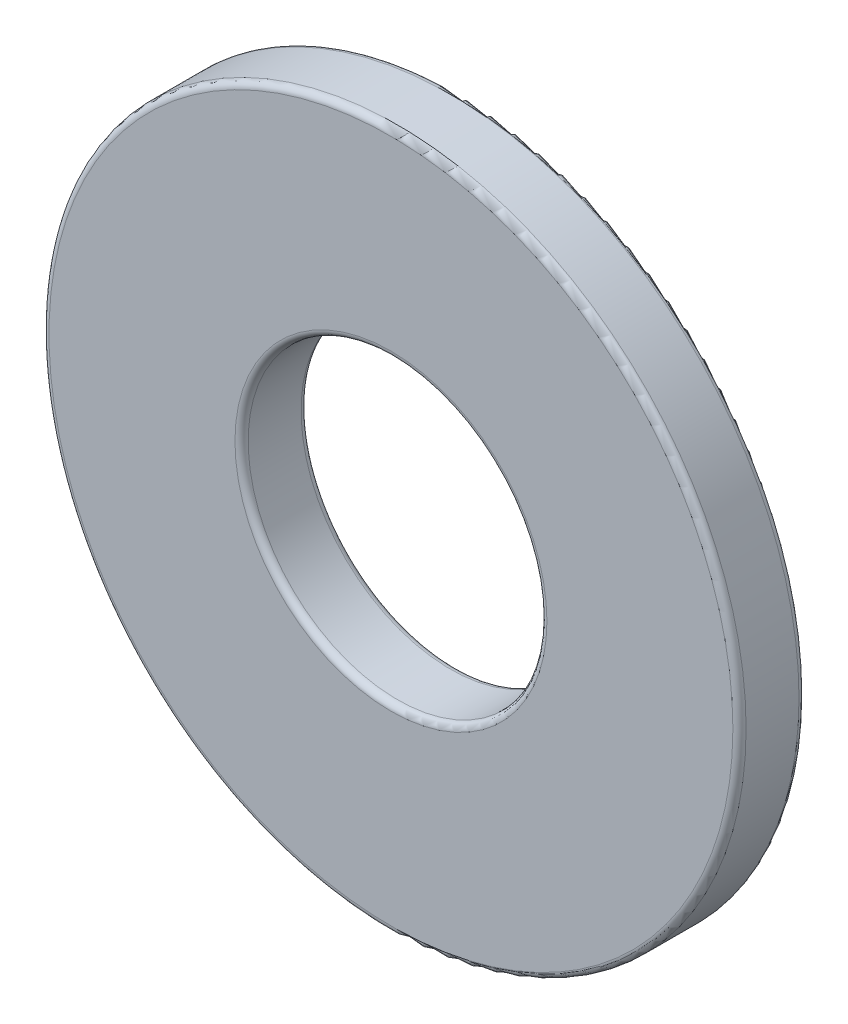
ISO-10303-21;
HEADER;
FILE_DESCRIPTION(('STEP AP214'),'2;1');
FILE_NAME('part.step','',(''),(''),'','','');
FILE_SCHEMA(('AUTOMOTIVE_DESIGN { 1 0 10303 214 1 1 1 1 }'));
ENDSEC;
DATA;
#1=APPLICATION_CONTEXT('core data for automotive mechanical design processes');
#2=APPLICATION_PROTOCOL_DEFINITION('international standard','automotive_design',2000,#1);
#3=PRODUCT_CONTEXT('',#1,'mechanical');
#4=PRODUCT('Part','Part','',(#3));
#5=PRODUCT_RELATED_PRODUCT_CATEGORY('part','',(#4));
#6=PRODUCT_DEFINITION_FORMATION('','',#4);
#7=PRODUCT_DEFINITION_CONTEXT('part definition',#1,'design');
#8=PRODUCT_DEFINITION('design','',#6,#7);
#9=PRODUCT_DEFINITION_SHAPE('','',#8);
#10=(LENGTH_UNIT() NAMED_UNIT(*) SI_UNIT(.MILLI.,.METRE.));
#11=(NAMED_UNIT(*) PLANE_ANGLE_UNIT() SI_UNIT($,.RADIAN.));
#12=(NAMED_UNIT(*) SI_UNIT($,.STERADIAN.) SOLID_ANGLE_UNIT());
#13=UNCERTAINTY_MEASURE_WITH_UNIT(LENGTH_MEASURE(1.E-05),#10,'distance_accuracy_value','');
#14=(GEOMETRIC_REPRESENTATION_CONTEXT(3) GLOBAL_UNCERTAINTY_ASSIGNED_CONTEXT((#13)) GLOBAL_UNIT_ASSIGNED_CONTEXT((#10,
#11,#12)) REPRESENTATION_CONTEXT('',''));
#15=CARTESIAN_POINT('',(0.,0.,0.));
#16=DIRECTION('',(0.,0.,1.));
#17=DIRECTION('',(1.,0.,0.));
#18=AXIS2_PLACEMENT_3D('',#15,#16,#17);
#19=CARTESIAN_POINT('',(0.,0.,-1.0541));
#20=DIRECTION('',(0.,0.,1.));
#21=DIRECTION('',(1.,0.,0.));
#22=AXIS2_PLACEMENT_3D('',#19,#20,#21);
#23=CYLINDRICAL_SURFACE('',#22,11.1125);
#24=CARTESIAN_POINT('',(0.,0.,-0.84328));
#25=DIRECTION('',(0.,0.,1.));
#26=DIRECTION('',(1.,0.,0.));
#27=AXIS2_PLACEMENT_3D('',#24,#25,#26);
#28=CIRCLE('',#27,11.1125);
#29=CARTESIAN_POINT('',(11.1125,0.,-0.84328));
#30=VERTEX_POINT('',#29);
#31=EDGE_CURVE('E68',#30,#30,#28,.T.);
#32=ORIENTED_EDGE('',*,*,#31,.T.);
#33=EDGE_LOOP('',(#32));
#34=FACE_BOUND('',#33,.T.);
#35=CARTESIAN_POINT('',(0.,0.,0.84328));
#36=DIRECTION('',(0.,0.,1.));
#37=DIRECTION('',(1.,0.,0.));
#38=AXIS2_PLACEMENT_3D('',#35,#36,#37);
#39=CIRCLE('',#38,11.1125);
#40=CARTESIAN_POINT('',(11.1125,0.,0.84328));
#41=VERTEX_POINT('',#40);
#42=EDGE_CURVE('E71',#41,#41,#39,.F.);
#43=ORIENTED_EDGE('',*,*,#42,.T.);
#44=EDGE_LOOP('',(#43));
#45=FACE_BOUND('',#44,.T.);
#46=ADVANCED_FACE('F34',(#34,#45),#23,.T.);
#47=CARTESIAN_POINT('',(0.,0.,-1.0541));
#48=DIRECTION('',(0.,0.,1.));
#49=DIRECTION('',(1.,0.,0.));
#50=AXIS2_PLACEMENT_3D('',#47,#48,#49);
#51=PLANE('',#50);
#52=CARTESIAN_POINT('',(0.,0.,-1.0541));
#53=DIRECTION('',(0.,0.,1.));
#54=DIRECTION('',(1.,0.,0.));
#55=AXIS2_PLACEMENT_3D('',#52,#53,#54);
#56=CIRCLE('',#55,10.90168);
#57=CARTESIAN_POINT('',(10.90168,0.,-1.0541));
#58=VERTEX_POINT('',#57);
#59=EDGE_CURVE('E60',#58,#58,#56,.F.);
#60=ORIENTED_EDGE('',*,*,#59,.T.);
#61=EDGE_LOOP('',(#60));
#62=FACE_BOUND('',#61,.T.);
#63=CARTESIAN_POINT('',(0.,0.,-1.0541));
#64=DIRECTION('',(0.,0.,1.));
#65=DIRECTION('',(1.,0.,0.));
#66=AXIS2_PLACEMENT_3D('',#63,#64,#65);
#67=CIRCLE('',#66,4.97332);
#68=CARTESIAN_POINT('',(4.97332,0.,-1.0541));
#69=VERTEX_POINT('',#68);
#70=EDGE_CURVE('E64',#69,#69,#67,.T.);
#71=ORIENTED_EDGE('',*,*,#70,.T.);
#72=EDGE_LOOP('',(#71));
#73=FACE_BOUND('',#72,.T.);
#74=ADVANCED_FACE('F85',(#62,#73),#51,.F.);
#75=CARTESIAN_POINT('',(0.,0.,-1.0541));
#76=DIRECTION('',(0.,0.,1.));
#77=DIRECTION('',(1.,0.,0.));
#78=AXIS2_PLACEMENT_3D('',#75,#76,#77);
#79=CYLINDRICAL_SURFACE('',#78,4.7625);
#80=CARTESIAN_POINT('',(0.,0.,-0.84328));
#81=DIRECTION('',(0.,0.,1.));
#82=DIRECTION('',(1.,0.,0.));
#83=AXIS2_PLACEMENT_3D('',#80,#81,#82);
#84=CIRCLE('',#83,4.7625);
#85=CARTESIAN_POINT('',(4.7625,0.,-0.84328));
#86=VERTEX_POINT('',#85);
#87=EDGE_CURVE('E49',#86,#86,#84,.F.);
#88=ORIENTED_EDGE('',*,*,#87,.T.);
#89=EDGE_LOOP('',(#88));
#90=FACE_BOUND('',#89,.T.);
#91=CARTESIAN_POINT('',(0.,0.,0.84328));
#92=DIRECTION('',(0.,0.,1.));
#93=DIRECTION('',(1.,0.,0.));
#94=AXIS2_PLACEMENT_3D('',#91,#92,#93);
#95=CIRCLE('',#94,4.7625);
#96=CARTESIAN_POINT('',(4.7625,0.,0.84328));
#97=VERTEX_POINT('',#96);
#98=EDGE_CURVE('E55',#97,#97,#95,.T.);
#99=ORIENTED_EDGE('',*,*,#98,.T.);
#100=EDGE_LOOP('',(#99));
#101=FACE_BOUND('',#100,.T.);
#102=ADVANCED_FACE('F91',(#90,#101),#79,.F.);
#103=CARTESIAN_POINT('',(0.,0.,1.0541));
#104=DIRECTION('',(0.,0.,1.));
#105=DIRECTION('',(1.,0.,0.));
#106=AXIS2_PLACEMENT_3D('',#103,#104,#105);
#107=PLANE('',#106);
#108=CARTESIAN_POINT('',(0.,0.,1.0541));
#109=DIRECTION('',(0.,0.,1.));
#110=DIRECTION('',(1.,0.,0.));
#111=AXIS2_PLACEMENT_3D('',#108,#109,#110);
#112=CIRCLE('',#111,4.97332);
#113=CARTESIAN_POINT('',(4.97332,0.,1.0541));
#114=VERTEX_POINT('',#113);
#115=EDGE_CURVE('E10',#114,#114,#112,.F.);
#116=ORIENTED_EDGE('',*,*,#115,.T.);
#117=EDGE_LOOP('',(#116));
#118=FACE_BOUND('',#117,.T.);
#119=CARTESIAN_POINT('',(0.,0.,1.0541));
#120=DIRECTION('',(0.,0.,1.));
#121=DIRECTION('',(1.,0.,0.));
#122=AXIS2_PLACEMENT_3D('',#119,#120,#121);
#123=CIRCLE('',#122,10.90168);
#124=CARTESIAN_POINT('',(10.90168,0.,1.0541));
#125=VERTEX_POINT('',#124);
#126=EDGE_CURVE('E42',#125,#125,#123,.T.);
#127=ORIENTED_EDGE('',*,*,#126,.T.);
#128=EDGE_LOOP('',(#127));
#129=FACE_BOUND('',#128,.T.);
#130=ADVANCED_FACE('F99',(#118,#129),#107,.T.);
#131=CARTESIAN_POINT('',(0.,0.,-0.84328));
#132=DIRECTION('',(0.,0.,1.));
#133=DIRECTION('',(1.,0.,0.));
#134=AXIS2_PLACEMENT_3D('',#131,#132,#133);
#135=TOROIDAL_SURFACE('',#134,10.90168,0.21082);
#136=ORIENTED_EDGE('',*,*,#59,.F.);
#137=EDGE_LOOP('',(#136));
#138=FACE_BOUND('',#137,.T.);
#139=ORIENTED_EDGE('',*,*,#31,.F.);
#140=EDGE_LOOP('',(#139));
#141=FACE_BOUND('',#140,.T.);
#142=ADVANCED_FACE('F96',(#138,#141),#135,.T.);
#143=CARTESIAN_POINT('',(0.,0.,-0.84328));
#144=DIRECTION('',(0.,0.,1.));
#145=DIRECTION('',(1.,0.,0.));
#146=AXIS2_PLACEMENT_3D('',#143,#144,#145);
#147=TOROIDAL_SURFACE('',#146,4.97332,0.21082);
#148=ORIENTED_EDGE('',*,*,#87,.F.);
#149=EDGE_LOOP('',(#148));
#150=FACE_BOUND('',#149,.T.);
#151=ORIENTED_EDGE('',*,*,#70,.F.);
#152=EDGE_LOOP('',(#151));
#153=FACE_BOUND('',#152,.T.);
#154=ADVANCED_FACE('F82',(#150,#153),#147,.T.);
#155=CARTESIAN_POINT('',(0.,0.,0.84328));
#156=DIRECTION('',(0.,0.,1.));
#157=DIRECTION('',(1.,0.,0.));
#158=AXIS2_PLACEMENT_3D('',#155,#156,#157);
#159=TOROIDAL_SURFACE('',#158,4.97332,0.21082);
#160=ORIENTED_EDGE('',*,*,#115,.F.);
#161=EDGE_LOOP('',(#160));
#162=FACE_BOUND('',#161,.T.);
#163=ORIENTED_EDGE('',*,*,#98,.F.);
#164=EDGE_LOOP('',(#163));
#165=FACE_BOUND('',#164,.T.);
#166=ADVANCED_FACE('F78',(#162,#165),#159,.T.);
#167=CARTESIAN_POINT('',(0.,0.,0.84328));
#168=DIRECTION('',(0.,0.,1.));
#169=DIRECTION('',(1.,0.,0.));
#170=AXIS2_PLACEMENT_3D('',#167,#168,#169);
#171=TOROIDAL_SURFACE('',#170,10.90168,0.21082);
#172=ORIENTED_EDGE('',*,*,#42,.F.);
#173=EDGE_LOOP('',(#172));
#174=FACE_BOUND('',#173,.T.);
#175=ORIENTED_EDGE('',*,*,#126,.F.);
#176=EDGE_LOOP('',(#175));
#177=FACE_BOUND('',#176,.T.);
#178=ADVANCED_FACE('F36',(#174,#177),#171,.T.);
#179=CLOSED_SHELL('',(#46,#74,#102,#130,#142,#154,#166,#178));
#180=MANIFOLD_SOLID_BREP('B2',#179);
#181=ADVANCED_BREP_SHAPE_REPRESENTATION('',(#18,#180),#14);
#182=SHAPE_DEFINITION_REPRESENTATION(#9,#181);
ENDSEC;
END-ISO-10303-21;
